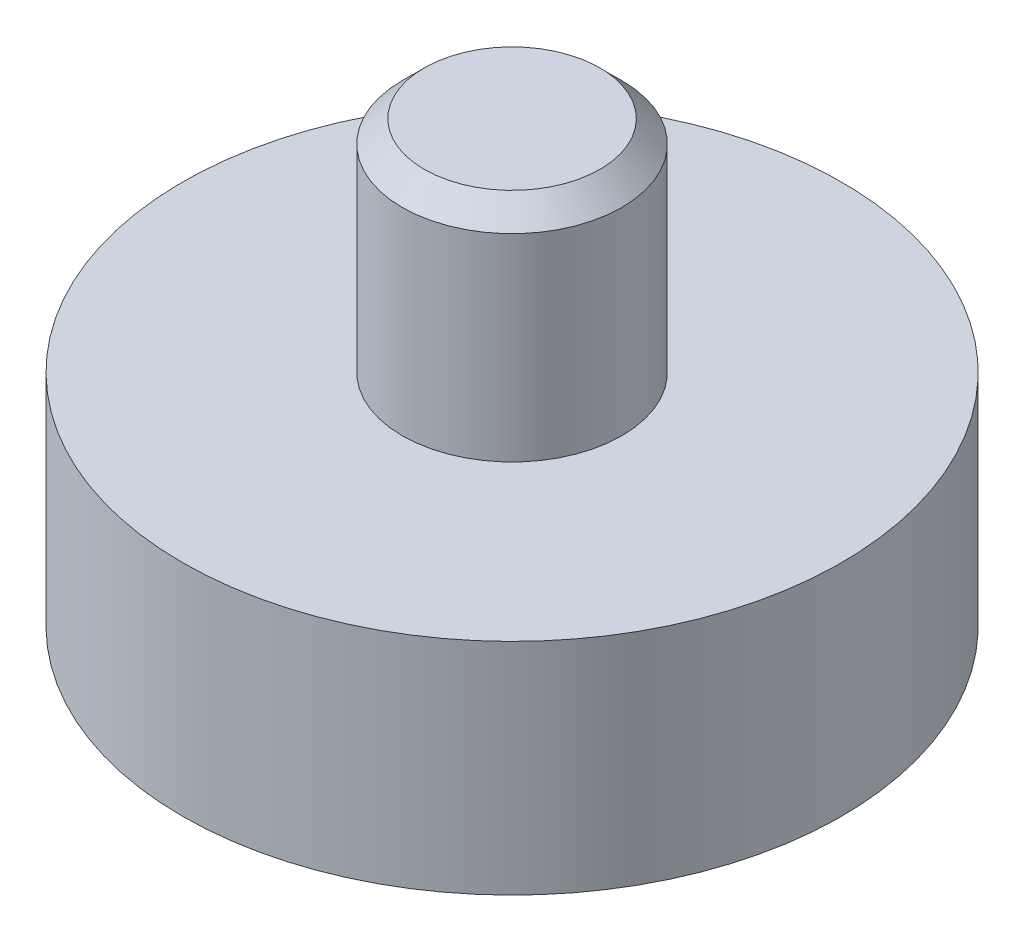
ISO-10303-21;
HEADER;
FILE_DESCRIPTION(('STEP AP214'),'2;1');
FILE_NAME('part.step','',(''),(''),'','','');
FILE_SCHEMA(('AUTOMOTIVE_DESIGN { 1 0 10303 214 1 1 1 1 }'));
ENDSEC;
DATA;
#1=APPLICATION_CONTEXT('core data for automotive mechanical design processes');
#2=APPLICATION_PROTOCOL_DEFINITION('international standard','automotive_design',2000,#1);
#3=PRODUCT_CONTEXT('',#1,'mechanical');
#4=PRODUCT('Part','Part','',(#3));
#5=PRODUCT_RELATED_PRODUCT_CATEGORY('part','',(#4));
#6=PRODUCT_DEFINITION_FORMATION('','',#4);
#7=PRODUCT_DEFINITION_CONTEXT('part definition',#1,'design');
#8=PRODUCT_DEFINITION('design','',#6,#7);
#9=PRODUCT_DEFINITION_SHAPE('','',#8);
#10=(LENGTH_UNIT() NAMED_UNIT(*) SI_UNIT(.MILLI.,.METRE.));
#11=(NAMED_UNIT(*) PLANE_ANGLE_UNIT() SI_UNIT($,.RADIAN.));
#12=(NAMED_UNIT(*) SI_UNIT($,.STERADIAN.) SOLID_ANGLE_UNIT());
#13=UNCERTAINTY_MEASURE_WITH_UNIT(LENGTH_MEASURE(1.E-05),#10,'distance_accuracy_value','');
#14=(GEOMETRIC_REPRESENTATION_CONTEXT(3) GLOBAL_UNCERTAINTY_ASSIGNED_CONTEXT((#13)) GLOBAL_UNIT_ASSIGNED_CONTEXT((#10,
#11,#12)) REPRESENTATION_CONTEXT('',''));
#15=CARTESIAN_POINT('',(0.,0.,0.));
#16=DIRECTION('',(0.,0.,1.));
#17=DIRECTION('',(1.,0.,0.));
#18=AXIS2_PLACEMENT_3D('',#15,#16,#17);
#19=CARTESIAN_POINT('',(-48.8510363778162,10.,-48.1678050998048));
#20=DIRECTION('',(0.,-1.,0.));
#21=DIRECTION('',(0.,0.,-1.));
#22=AXIS2_PLACEMENT_3D('',#19,#20,#21);
#23=CYLINDRICAL_SURFACE('',#22,15.);
#24=CARTESIAN_POINT('',(-48.8510363778162,10.,-48.1678050998048));
#25=DIRECTION('',(0.,1.,0.));
#26=DIRECTION('',(0.,0.,1.));
#27=AXIS2_PLACEMENT_3D('',#24,#25,#26);
#28=CIRCLE('',#27,15.);
#29=CARTESIAN_POINT('',(-48.8510363778162,10.,-33.1678050998048));
#30=VERTEX_POINT('',#29);
#31=EDGE_CURVE('E42',#30,#30,#28,.T.);
#32=ORIENTED_EDGE('',*,*,#31,.F.);
#33=EDGE_LOOP('',(#32));
#34=FACE_BOUND('',#33,.T.);
#35=CARTESIAN_POINT('',(-48.8510363778162,0.,-48.1678050998048));
#36=DIRECTION('',(0.,1.,0.));
#37=DIRECTION('',(0.,0.,1.));
#38=AXIS2_PLACEMENT_3D('',#35,#36,#37);
#39=CIRCLE('',#38,15.);
#40=CARTESIAN_POINT('',(-48.8510363778162,0.,-33.1678050998048));
#41=VERTEX_POINT('',#40);
#42=EDGE_CURVE('E46',#41,#41,#39,.T.);
#43=ORIENTED_EDGE('',*,*,#42,.T.);
#44=EDGE_LOOP('',(#43));
#45=FACE_BOUND('',#44,.T.);
#46=ADVANCED_FACE('F31',(#34,#45),#23,.T.);
#47=CARTESIAN_POINT('',(-48.8510363778162,10.,-48.1678050998048));
#48=DIRECTION('',(0.,1.,0.));
#49=DIRECTION('',(0.,0.,1.));
#50=AXIS2_PLACEMENT_3D('',#47,#48,#49);
#51=PLANE('',#50);
#52=CARTESIAN_POINT('',(-48.8510363778162,10.,-48.1678050998048));
#53=DIRECTION('',(0.,1.,0.));
#54=DIRECTION('',(0.,0.,1.));
#55=AXIS2_PLACEMENT_3D('',#52,#53,#54);
#56=CIRCLE('',#55,5.);
#57=CARTESIAN_POINT('',(-48.8510363778162,10.,-43.1678050998048));
#58=VERTEX_POINT('',#57);
#59=EDGE_CURVE('E50',#58,#58,#56,.T.);
#60=ORIENTED_EDGE('',*,*,#59,.F.);
#61=EDGE_LOOP('',(#60));
#62=FACE_BOUND('',#61,.T.);
#63=ORIENTED_EDGE('',*,*,#31,.T.);
#64=EDGE_LOOP('',(#63));
#65=FACE_BOUND('',#64,.T.);
#66=ADVANCED_FACE('F57',(#62,#65),#51,.T.);
#67=CARTESIAN_POINT('',(-48.8510363778162,0.,-48.1678050998048));
#68=DIRECTION('',(0.,1.,0.));
#69=DIRECTION('',(0.,0.,1.));
#70=AXIS2_PLACEMENT_3D('',#67,#68,#69);
#71=PLANE('',#70);
#72=ORIENTED_EDGE('',*,*,#42,.F.);
#73=EDGE_LOOP('',(#72));
#74=FACE_BOUND('',#73,.T.);
#75=ADVANCED_FACE('F60',(#74),#71,.F.);
#76=CARTESIAN_POINT('',(-48.8510363778162,20.,-48.1678050998048));
#77=DIRECTION('',(0.,-1.,0.));
#78=DIRECTION('',(0.,0.,-1.));
#79=AXIS2_PLACEMENT_3D('',#76,#77,#78);
#80=CYLINDRICAL_SURFACE('',#79,5.);
#81=CARTESIAN_POINT('',(-48.8510363778162,19.,-48.1678050998048));
#82=DIRECTION('',(0.,1.,0.));
#83=DIRECTION('',(0.,0.,1.));
#84=AXIS2_PLACEMENT_3D('',#81,#82,#83);
#85=CIRCLE('',#84,5.);
#86=CARTESIAN_POINT('',(-48.8510363778162,19.,-43.1678050998048));
#87=VERTEX_POINT('',#86);
#88=EDGE_CURVE('E10',#87,#87,#85,.F.);
#89=ORIENTED_EDGE('',*,*,#88,.T.);
#90=EDGE_LOOP('',(#89));
#91=FACE_BOUND('',#90,.T.);
#92=ORIENTED_EDGE('',*,*,#59,.T.);
#93=EDGE_LOOP('',(#92));
#94=FACE_BOUND('',#93,.T.);
#95=ADVANCED_FACE('F55',(#91,#94),#80,.T.);
#96=CARTESIAN_POINT('',(-48.8510363778162,20.,-48.1678050998048));
#97=DIRECTION('',(0.,1.,0.));
#98=DIRECTION('',(0.,0.,1.));
#99=AXIS2_PLACEMENT_3D('',#96,#97,#98);
#100=PLANE('',#99);
#101=CARTESIAN_POINT('',(-48.8510363778162,20.,-48.1678050998048));
#102=DIRECTION('',(0.,1.,0.));
#103=DIRECTION('',(0.,0.,1.));
#104=AXIS2_PLACEMENT_3D('',#101,#102,#103);
#105=CIRCLE('',#104,3.99999999999999);
#106=CARTESIAN_POINT('',(-48.8510363778162,20.,-44.1678050998048));
#107=VERTEX_POINT('',#106);
#108=EDGE_CURVE('E38',#107,#107,#105,.T.);
#109=ORIENTED_EDGE('',*,*,#108,.T.);
#110=EDGE_LOOP('',(#109));
#111=FACE_BOUND('',#110,.T.);
#112=ADVANCED_FACE('F73',(#111),#100,.T.);
#113=CARTESIAN_POINT('',(-48.8510363778162,20.,-48.1678050998048));
#114=DIRECTION('',(0.,-1.,0.));
#115=DIRECTION('',(0.,0.,-1.));
#116=AXIS2_PLACEMENT_3D('',#113,#114,#115);
#117=CONICAL_SURFACE('',#116,3.99999999999999,0.785398163397443);
#118=ORIENTED_EDGE('',*,*,#88,.F.);
#119=EDGE_LOOP('',(#118));
#120=FACE_BOUND('',#119,.T.);
#121=ORIENTED_EDGE('',*,*,#108,.F.);
#122=EDGE_LOOP('',(#121));
#123=FACE_BOUND('',#122,.T.);
#124=ADVANCED_FACE('F33',(#120,#123),#117,.T.);
#125=CLOSED_SHELL('',(#46,#66,#75,#95,#112,#124));
#126=MANIFOLD_SOLID_BREP('B2',#125);
#127=ADVANCED_BREP_SHAPE_REPRESENTATION('',(#18,#126),#14);
#128=SHAPE_DEFINITION_REPRESENTATION(#9,#127);
ENDSEC;
END-ISO-10303-21;
